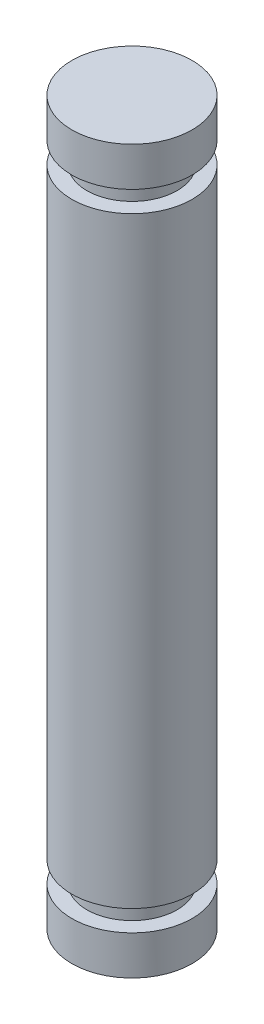
ISO-10303-21;
HEADER;
FILE_DESCRIPTION(('STEP AP214'),'2;1');
FILE_NAME('part.step','',(''),(''),'','','');
FILE_SCHEMA(('AUTOMOTIVE_DESIGN { 1 0 10303 214 1 1 1 1 }'));
ENDSEC;
DATA;
#1=APPLICATION_CONTEXT('core data for automotive mechanical design processes');
#2=APPLICATION_PROTOCOL_DEFINITION('international standard','automotive_design',2000,#1);
#3=PRODUCT_CONTEXT('',#1,'mechanical');
#4=PRODUCT('Part','Part','',(#3));
#5=PRODUCT_RELATED_PRODUCT_CATEGORY('part','',(#4));
#6=PRODUCT_DEFINITION_FORMATION('','',#4);
#7=PRODUCT_DEFINITION_CONTEXT('part definition',#1,'design');
#8=PRODUCT_DEFINITION('design','',#6,#7);
#9=PRODUCT_DEFINITION_SHAPE('','',#8);
#10=(LENGTH_UNIT() NAMED_UNIT(*) SI_UNIT(.MILLI.,.METRE.));
#11=(NAMED_UNIT(*) PLANE_ANGLE_UNIT() SI_UNIT($,.RADIAN.));
#12=(NAMED_UNIT(*) SI_UNIT($,.STERADIAN.) SOLID_ANGLE_UNIT());
#13=UNCERTAINTY_MEASURE_WITH_UNIT(LENGTH_MEASURE(1.E-05),#10,'distance_accuracy_value','');
#14=(GEOMETRIC_REPRESENTATION_CONTEXT(3) GLOBAL_UNCERTAINTY_ASSIGNED_CONTEXT((#13)) GLOBAL_UNIT_ASSIGNED_CONTEXT((#10,
#11,#12)) REPRESENTATION_CONTEXT('',''));
#15=CARTESIAN_POINT('',(0.,0.,0.));
#16=DIRECTION('',(0.,0.,1.));
#17=DIRECTION('',(1.,0.,0.));
#18=AXIS2_PLACEMENT_3D('',#15,#16,#17);
#19=CARTESIAN_POINT('',(0.,24.,0.));
#20=DIRECTION('',(0.,-1.,0.));
#21=DIRECTION('',(0.,0.,-1.));
#22=AXIS2_PLACEMENT_3D('',#19,#20,#21);
#23=CYLINDRICAL_SURFACE('',#22,2.);
#24=CARTESIAN_POINT('',(0.,22.,0.));
#25=DIRECTION('',(0.,1.,0.));
#26=DIRECTION('',(0.,0.,1.));
#27=AXIS2_PLACEMENT_3D('',#24,#25,#26);
#28=CIRCLE('',#27,2.);
#29=CARTESIAN_POINT('',(0.,22.,2.));
#30=VERTEX_POINT('',#29);
#31=EDGE_CURVE('E56',#30,#30,#28,.T.);
#32=ORIENTED_EDGE('',*,*,#31,.F.);
#33=EDGE_LOOP('',(#32));
#34=FACE_BOUND('',#33,.T.);
#35=CARTESIAN_POINT('',(0.,2.,0.));
#36=DIRECTION('',(0.,-1.,0.));
#37=DIRECTION('',(0.,0.,-1.));
#38=AXIS2_PLACEMENT_3D('',#35,#36,#37);
#39=CIRCLE('',#38,2.);
#40=CARTESIAN_POINT('',(0.,2.,-2.));
#41=VERTEX_POINT('',#40);
#42=EDGE_CURVE('E70',#41,#41,#39,.T.);
#43=ORIENTED_EDGE('',*,*,#42,.F.);
#44=EDGE_LOOP('',(#43));
#45=FACE_BOUND('',#44,.T.);
#46=ADVANCED_FACE('F43',(#34,#45),#23,.T.);
#47=CARTESIAN_POINT('',(0.,22.,0.));
#48=DIRECTION('',(0.,1.,0.));
#49=DIRECTION('',(0.,0.,1.));
#50=AXIS2_PLACEMENT_3D('',#47,#48,#49);
#51=PLANE('',#50);
#52=CARTESIAN_POINT('',(0.,22.,0.));
#53=DIRECTION('',(0.,1.,0.));
#54=DIRECTION('',(0.,0.,1.));
#55=AXIS2_PLACEMENT_3D('',#52,#53,#54);
#56=CIRCLE('',#55,1.5);
#57=CARTESIAN_POINT('',(0.,22.,1.5));
#58=VERTEX_POINT('',#57);
#59=EDGE_CURVE('E62',#58,#58,#56,.T.);
#60=ORIENTED_EDGE('',*,*,#59,.F.);
#61=EDGE_LOOP('',(#60));
#62=FACE_BOUND('',#61,.T.);
#63=ORIENTED_EDGE('',*,*,#31,.T.);
#64=EDGE_LOOP('',(#63));
#65=FACE_BOUND('',#64,.T.);
#66=ADVANCED_FACE('F101',(#62,#65),#51,.T.);
#67=CARTESIAN_POINT('',(0.,22.7,0.));
#68=DIRECTION('',(0.,1.,0.));
#69=DIRECTION('',(0.,0.,1.));
#70=AXIS2_PLACEMENT_3D('',#67,#68,#69);
#71=PLANE('',#70);
#72=CARTESIAN_POINT('',(0.,22.7,0.));
#73=DIRECTION('',(0.,1.,0.));
#74=DIRECTION('',(0.,0.,1.));
#75=AXIS2_PLACEMENT_3D('',#72,#73,#74);
#76=CIRCLE('',#75,1.5);
#77=CARTESIAN_POINT('',(0.,22.7,1.5));
#78=VERTEX_POINT('',#77);
#79=EDGE_CURVE('E66',#78,#78,#76,.T.);
#80=ORIENTED_EDGE('',*,*,#79,.T.);
#81=EDGE_LOOP('',(#80));
#82=FACE_BOUND('',#81,.T.);
#83=CARTESIAN_POINT('',(0.,22.7,0.));
#84=DIRECTION('',(0.,1.,0.));
#85=DIRECTION('',(0.,0.,1.));
#86=AXIS2_PLACEMENT_3D('',#83,#84,#85);
#87=CIRCLE('',#86,2.);
#88=CARTESIAN_POINT('',(0.,22.7,2.));
#89=VERTEX_POINT('',#88);
#90=EDGE_CURVE('E58',#89,#89,#87,.T.);
#91=ORIENTED_EDGE('',*,*,#90,.F.);
#92=EDGE_LOOP('',(#91));
#93=FACE_BOUND('',#92,.T.);
#94=ADVANCED_FACE('F108',(#82,#93),#71,.F.);
#95=CARTESIAN_POINT('',(0.,22.,0.));
#96=DIRECTION('',(0.,1.,0.));
#97=DIRECTION('',(0.,0.,1.));
#98=AXIS2_PLACEMENT_3D('',#95,#96,#97);
#99=CYLINDRICAL_SURFACE('',#98,1.5);
#100=ORIENTED_EDGE('',*,*,#59,.T.);
#101=EDGE_LOOP('',(#100));
#102=FACE_BOUND('',#101,.T.);
#103=ORIENTED_EDGE('',*,*,#79,.F.);
#104=EDGE_LOOP('',(#103));
#105=FACE_BOUND('',#104,.T.);
#106=ADVANCED_FACE('F121',(#102,#105),#99,.T.);
#107=CARTESIAN_POINT('',(0.,24.,0.));
#108=DIRECTION('',(0.,1.,0.));
#109=DIRECTION('',(0.,0.,1.));
#110=AXIS2_PLACEMENT_3D('',#107,#108,#109);
#111=PLANE('',#110);
#112=CARTESIAN_POINT('',(0.,24.,0.));
#113=DIRECTION('',(0.,1.,0.));
#114=DIRECTION('',(0.,0.,1.));
#115=AXIS2_PLACEMENT_3D('',#112,#113,#114);
#116=CIRCLE('',#115,2.);
#117=CARTESIAN_POINT('',(0.,24.,2.));
#118=VERTEX_POINT('',#117);
#119=EDGE_CURVE('E10',#118,#118,#116,.T.);
#120=ORIENTED_EDGE('',*,*,#119,.T.);
#121=EDGE_LOOP('',(#120));
#122=FACE_BOUND('',#121,.T.);
#123=ADVANCED_FACE('F115',(#122),#111,.T.);
#124=ORIENTED_EDGE('',*,*,#90,.T.);
#125=EDGE_LOOP('',(#124));
#126=FACE_BOUND('',#125,.T.);
#127=ORIENTED_EDGE('',*,*,#119,.F.);
#128=EDGE_LOOP('',(#127));
#129=FACE_BOUND('',#128,.T.);
#130=ADVANCED_FACE('F45',(#126,#129),#23,.T.);
#131=CARTESIAN_POINT('',(0.,2.,0.));
#132=DIRECTION('',(0.,-1.,0.));
#133=DIRECTION('',(0.,0.,-1.));
#134=AXIS2_PLACEMENT_3D('',#131,#132,#133);
#135=PLANE('',#134);
#136=CARTESIAN_POINT('',(0.,2.,0.));
#137=DIRECTION('',(0.,-1.,0.));
#138=DIRECTION('',(0.,0.,-1.));
#139=AXIS2_PLACEMENT_3D('',#136,#137,#138);
#140=CIRCLE('',#139,1.5);
#141=CARTESIAN_POINT('',(0.,2.,-1.5));
#142=VERTEX_POINT('',#141);
#143=EDGE_CURVE('E78',#142,#142,#140,.T.);
#144=ORIENTED_EDGE('',*,*,#143,.F.);
#145=EDGE_LOOP('',(#144));
#146=FACE_BOUND('',#145,.T.);
#147=ORIENTED_EDGE('',*,*,#42,.T.);
#148=EDGE_LOOP('',(#147));
#149=FACE_BOUND('',#148,.T.);
#150=ADVANCED_FACE('F93',(#146,#149),#135,.T.);
#151=CARTESIAN_POINT('',(0.,1.3,0.));
#152=DIRECTION('',(0.,-1.,0.));
#153=DIRECTION('',(0.,0.,-1.));
#154=AXIS2_PLACEMENT_3D('',#151,#152,#153);
#155=PLANE('',#154);
#156=CARTESIAN_POINT('',(0.,1.3,0.));
#157=DIRECTION('',(0.,-1.,0.));
#158=DIRECTION('',(0.,0.,-1.));
#159=AXIS2_PLACEMENT_3D('',#156,#157,#158);
#160=CIRCLE('',#159,1.5);
#161=CARTESIAN_POINT('',(0.,1.3,-1.5));
#162=VERTEX_POINT('',#161);
#163=EDGE_CURVE('E82',#162,#162,#160,.T.);
#164=ORIENTED_EDGE('',*,*,#163,.T.);
#165=EDGE_LOOP('',(#164));
#166=FACE_BOUND('',#165,.T.);
#167=CARTESIAN_POINT('',(0.,1.3,0.));
#168=DIRECTION('',(0.,-1.,0.));
#169=DIRECTION('',(0.,0.,-1.));
#170=AXIS2_PLACEMENT_3D('',#167,#168,#169);
#171=CIRCLE('',#170,2.);
#172=CARTESIAN_POINT('',(0.,1.3,-2.));
#173=VERTEX_POINT('',#172);
#174=EDGE_CURVE('E74',#173,#173,#171,.T.);
#175=ORIENTED_EDGE('',*,*,#174,.F.);
#176=EDGE_LOOP('',(#175));
#177=FACE_BOUND('',#176,.T.);
#178=ADVANCED_FACE('F96',(#166,#177),#155,.F.);
#179=CARTESIAN_POINT('',(0.,2.,0.));
#180=DIRECTION('',(0.,-1.,0.));
#181=DIRECTION('',(0.,0.,-1.));
#182=AXIS2_PLACEMENT_3D('',#179,#180,#181);
#183=CYLINDRICAL_SURFACE('',#182,1.5);
#184=ORIENTED_EDGE('',*,*,#143,.T.);
#185=EDGE_LOOP('',(#184));
#186=FACE_BOUND('',#185,.T.);
#187=ORIENTED_EDGE('',*,*,#163,.F.);
#188=EDGE_LOOP('',(#187));
#189=FACE_BOUND('',#188,.T.);
#190=ADVANCED_FACE('F90',(#186,#189),#183,.T.);
#191=CARTESIAN_POINT('',(0.,0.,0.));
#192=DIRECTION('',(0.,1.,0.));
#193=DIRECTION('',(0.,0.,1.));
#194=AXIS2_PLACEMENT_3D('',#191,#192,#193);
#195=PLANE('',#194);
#196=CARTESIAN_POINT('',(0.,0.,0.));
#197=DIRECTION('',(0.,1.,0.));
#198=DIRECTION('',(0.,0.,1.));
#199=AXIS2_PLACEMENT_3D('',#196,#197,#198);
#200=CIRCLE('',#199,2.);
#201=CARTESIAN_POINT('',(0.,0.,2.));
#202=VERTEX_POINT('',#201);
#203=EDGE_CURVE('E47',#202,#202,#200,.T.);
#204=ORIENTED_EDGE('',*,*,#203,.F.);
#205=EDGE_LOOP('',(#204));
#206=FACE_BOUND('',#205,.T.);
#207=ADVANCED_FACE('F113',(#206),#195,.F.);
#208=ORIENTED_EDGE('',*,*,#174,.T.);
#209=EDGE_LOOP('',(#208));
#210=FACE_BOUND('',#209,.T.);
#211=ORIENTED_EDGE('',*,*,#203,.T.);
#212=EDGE_LOOP('',(#211));
#213=FACE_BOUND('',#212,.T.);
#214=ADVANCED_FACE('F103',(#210,#213),#23,.T.);
#215=CLOSED_SHELL('',(#46,#66,#94,#106,#123,#130,#150,#178,#190,#207,#214));
#216=MANIFOLD_SOLID_BREP('B2',#215);
#217=ADVANCED_BREP_SHAPE_REPRESENTATION('',(#18,#216),#14);
#218=SHAPE_DEFINITION_REPRESENTATION(#9,#217);
ENDSEC;
END-ISO-10303-21;
